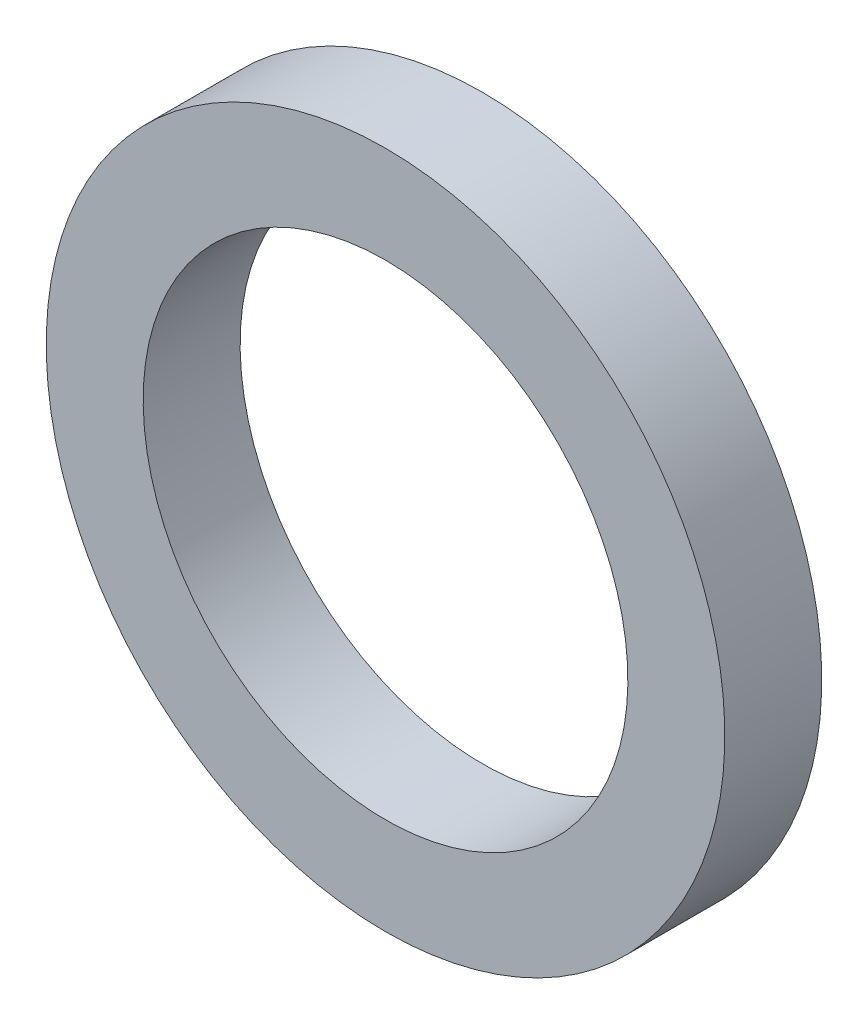
ISO-10303-21;
HEADER;
FILE_DESCRIPTION(('STEP AP214'),'2;1');
FILE_NAME('part.step','',(''),(''),'','','');
FILE_SCHEMA(('AUTOMOTIVE_DESIGN { 1 0 10303 214 1 1 1 1 }'));
ENDSEC;
DATA;
#1=APPLICATION_CONTEXT('core data for automotive mechanical design processes');
#2=APPLICATION_PROTOCOL_DEFINITION('international standard','automotive_design',2000,#1);
#3=PRODUCT_CONTEXT('',#1,'mechanical');
#4=PRODUCT('Part','Part','',(#3));
#5=PRODUCT_RELATED_PRODUCT_CATEGORY('part','',(#4));
#6=PRODUCT_DEFINITION_FORMATION('','',#4);
#7=PRODUCT_DEFINITION_CONTEXT('part definition',#1,'design');
#8=PRODUCT_DEFINITION('design','',#6,#7);
#9=PRODUCT_DEFINITION_SHAPE('','',#8);
#10=(LENGTH_UNIT() NAMED_UNIT(*) SI_UNIT(.MILLI.,.METRE.));
#11=(NAMED_UNIT(*) PLANE_ANGLE_UNIT() SI_UNIT($,.RADIAN.));
#12=(NAMED_UNIT(*) SI_UNIT($,.STERADIAN.) SOLID_ANGLE_UNIT());
#13=UNCERTAINTY_MEASURE_WITH_UNIT(LENGTH_MEASURE(1.E-05),#10,'distance_accuracy_value','');
#14=(GEOMETRIC_REPRESENTATION_CONTEXT(3) GLOBAL_UNCERTAINTY_ASSIGNED_CONTEXT((#13)) GLOBAL_UNIT_ASSIGNED_CONTEXT((#10,
#11,#12)) REPRESENTATION_CONTEXT('',''));
#15=CARTESIAN_POINT('',(0.,0.,0.));
#16=DIRECTION('',(0.,0.,1.));
#17=DIRECTION('',(1.,0.,0.));
#18=AXIS2_PLACEMENT_3D('',#15,#16,#17);
#19=CARTESIAN_POINT('',(0.,17.78,5.08));
#20=DIRECTION('',(0.,0.,1.));
#21=DIRECTION('',(0.,-1.,0.));
#22=AXIS2_PLACEMENT_3D('',#19,#20,#21);
#23=PLANE('',#22);
#24=CARTESIAN_POINT('',(0.,0.,5.08));
#25=DIRECTION('',(0.,0.,-1.));
#26=DIRECTION('',(0.,1.,0.));
#27=AXIS2_PLACEMENT_3D('',#24,#25,#26);
#28=CIRCLE('',#27,12.7);
#29=CARTESIAN_POINT('',(0.,12.7,5.08));
#30=VERTEX_POINT('',#29);
#31=EDGE_CURVE('E10',#30,#30,#28,.T.);
#32=ORIENTED_EDGE('',*,*,#31,.T.);
#33=EDGE_LOOP('',(#32));
#34=FACE_BOUND('',#33,.T.);
#35=CARTESIAN_POINT('',(0.,0.,5.08));
#36=DIRECTION('',(0.,0.,-1.));
#37=DIRECTION('',(0.,1.,0.));
#38=AXIS2_PLACEMENT_3D('',#35,#36,#37);
#39=CIRCLE('',#38,17.78);
#40=CARTESIAN_POINT('',(0.,17.78,5.08));
#41=VERTEX_POINT('',#40);
#42=EDGE_CURVE('E42',#41,#41,#39,.T.);
#43=ORIENTED_EDGE('',*,*,#42,.F.);
#44=EDGE_LOOP('',(#43));
#45=FACE_BOUND('',#44,.T.);
#46=ADVANCED_FACE('F28',(#34,#45),#23,.T.);
#47=CARTESIAN_POINT('',(0.,0.,0.));
#48=DIRECTION('',(0.,0.,-1.));
#49=DIRECTION('',(0.,1.,0.));
#50=AXIS2_PLACEMENT_3D('',#47,#48,#49);
#51=CYLINDRICAL_SURFACE('',#50,12.7);
#52=CARTESIAN_POINT('',(0.,0.,0.));
#53=DIRECTION('',(0.,0.,-1.));
#54=DIRECTION('',(0.,1.,0.));
#55=AXIS2_PLACEMENT_3D('',#52,#53,#54);
#56=CIRCLE('',#55,12.7);
#57=CARTESIAN_POINT('',(0.,12.7,0.));
#58=VERTEX_POINT('',#57);
#59=EDGE_CURVE('E34',#58,#58,#56,.T.);
#60=ORIENTED_EDGE('',*,*,#59,.T.);
#61=EDGE_LOOP('',(#60));
#62=FACE_BOUND('',#61,.T.);
#63=ORIENTED_EDGE('',*,*,#31,.F.);
#64=EDGE_LOOP('',(#63));
#65=FACE_BOUND('',#64,.T.);
#66=ADVANCED_FACE('F52',(#62,#65),#51,.F.);
#67=CARTESIAN_POINT('',(0.,17.78,0.));
#68=DIRECTION('',(0.,0.,-1.));
#69=DIRECTION('',(0.,1.,0.));
#70=AXIS2_PLACEMENT_3D('',#67,#68,#69);
#71=PLANE('',#70);
#72=CARTESIAN_POINT('',(0.,0.,0.));
#73=DIRECTION('',(0.,0.,-1.));
#74=DIRECTION('',(0.,1.,0.));
#75=AXIS2_PLACEMENT_3D('',#72,#73,#74);
#76=CIRCLE('',#75,17.78);
#77=CARTESIAN_POINT('',(0.,17.78,0.));
#78=VERTEX_POINT('',#77);
#79=EDGE_CURVE('E38',#78,#78,#76,.T.);
#80=ORIENTED_EDGE('',*,*,#79,.T.);
#81=EDGE_LOOP('',(#80));
#82=FACE_BOUND('',#81,.T.);
#83=ORIENTED_EDGE('',*,*,#59,.F.);
#84=EDGE_LOOP('',(#83));
#85=FACE_BOUND('',#84,.T.);
#86=ADVANCED_FACE('F56',(#82,#85),#71,.T.);
#87=CARTESIAN_POINT('',(0.,0.,0.));
#88=DIRECTION('',(0.,0.,-1.));
#89=DIRECTION('',(0.,1.,0.));
#90=AXIS2_PLACEMENT_3D('',#87,#88,#89);
#91=CYLINDRICAL_SURFACE('',#90,17.78);
#92=ORIENTED_EDGE('',*,*,#42,.T.);
#93=EDGE_LOOP('',(#92));
#94=FACE_BOUND('',#93,.T.);
#95=ORIENTED_EDGE('',*,*,#79,.F.);
#96=EDGE_LOOP('',(#95));
#97=FACE_BOUND('',#96,.T.);
#98=ADVANCED_FACE('F48',(#94,#97),#91,.T.);
#99=CLOSED_SHELL('',(#46,#66,#86,#98));
#100=MANIFOLD_SOLID_BREP('B2',#99);
#101=ADVANCED_BREP_SHAPE_REPRESENTATION('',(#18,#100),#14);
#102=SHAPE_DEFINITION_REPRESENTATION(#9,#101);
ENDSEC;
END-ISO-10303-21;
